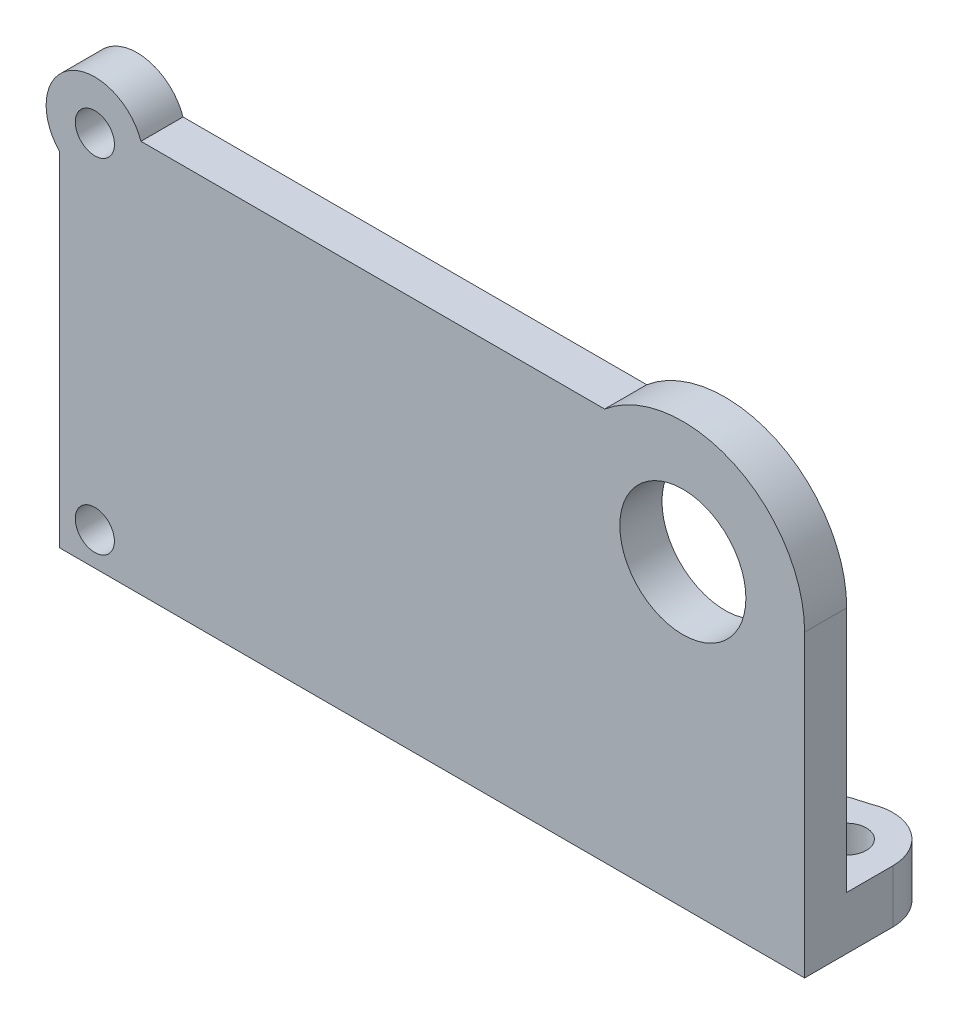
ISO-10303-21;
HEADER;
FILE_DESCRIPTION(('STEP AP214'),'2;1');
FILE_NAME('part.step','',(''),(''),'','','');
FILE_SCHEMA(('AUTOMOTIVE_DESIGN { 1 0 10303 214 1 1 1 1 }'));
ENDSEC;
DATA;
#1=APPLICATION_CONTEXT('core data for automotive mechanical design processes');
#2=APPLICATION_PROTOCOL_DEFINITION('international standard','automotive_design',2000,#1);
#3=PRODUCT_CONTEXT('',#1,'mechanical');
#4=PRODUCT('Part','Part','',(#3));
#5=PRODUCT_RELATED_PRODUCT_CATEGORY('part','',(#4));
#6=PRODUCT_DEFINITION_FORMATION('','',#4);
#7=PRODUCT_DEFINITION_CONTEXT('part definition',#1,'design');
#8=PRODUCT_DEFINITION('design','',#6,#7);
#9=PRODUCT_DEFINITION_SHAPE('','',#8);
#10=(LENGTH_UNIT() NAMED_UNIT(*) SI_UNIT(.MILLI.,.METRE.));
#11=(NAMED_UNIT(*) PLANE_ANGLE_UNIT() SI_UNIT($,.RADIAN.));
#12=(NAMED_UNIT(*) SI_UNIT($,.STERADIAN.) SOLID_ANGLE_UNIT());
#13=UNCERTAINTY_MEASURE_WITH_UNIT(LENGTH_MEASURE(1.E-05),#10,'distance_accuracy_value','');
#14=(GEOMETRIC_REPRESENTATION_CONTEXT(3) GLOBAL_UNCERTAINTY_ASSIGNED_CONTEXT((#13)) GLOBAL_UNIT_ASSIGNED_CONTEXT((#10,
#11,#12)) REPRESENTATION_CONTEXT('',''));
#15=CARTESIAN_POINT('',(0.,0.,0.));
#16=DIRECTION('',(0.,0.,1.));
#17=DIRECTION('',(1.,0.,0.));
#18=AXIS2_PLACEMENT_3D('',#15,#16,#17);
#19=CARTESIAN_POINT('',(0.,0.,0.));
#20=DIRECTION('',(0.,0.,1.));
#21=DIRECTION('',(1.,0.,0.));
#22=AXIS2_PLACEMENT_3D('',#19,#20,#21);
#23=PLANE('',#22);
#24=CARTESIAN_POINT('',(40.576,7.77,0.));
#25=DIRECTION('',(0.,0.,-1.));
#26=DIRECTION('',(-1.,0.,0.));
#27=AXIS2_PLACEMENT_3D('',#24,#25,#26);
#28=CIRCLE('',#27,4.75);
#29=CARTESIAN_POINT('',(35.826,7.77,0.));
#30=VERTEX_POINT('',#29);
#31=EDGE_CURVE('E244',#30,#30,#28,.T.);
#32=ORIENTED_EDGE('',*,*,#31,.F.);
#33=EDGE_LOOP('',(#32));
#34=FACE_BOUND('',#33,.T.);
#35=CARTESIAN_POINT('',(-3.73600000000001,13.59,0.));
#36=DIRECTION('',(0.,0.,-1.));
#37=DIRECTION('',(-1.,0.,0.));
#38=AXIS2_PLACEMENT_3D('',#35,#36,#37);
#39=CIRCLE('',#38,1.475);
#40=CARTESIAN_POINT('',(-5.21100000000001,13.59,0.));
#41=VERTEX_POINT('',#40);
#42=EDGE_CURVE('E208',#41,#41,#39,.T.);
#43=ORIENTED_EDGE('',*,*,#42,.F.);
#44=EDGE_LOOP('',(#43));
#45=FACE_BOUND('',#44,.T.);
#46=CARTESIAN_POINT('',(-3.741,-12.3,0.));
#47=DIRECTION('',(0.,0.,-1.));
#48=DIRECTION('',(-1.,0.,0.));
#49=AXIS2_PLACEMENT_3D('',#46,#47,#48);
#50=CIRCLE('',#49,1.475);
#51=CARTESIAN_POINT('',(-5.21600000000001,-12.3,0.));
#52=VERTEX_POINT('',#51);
#53=EDGE_CURVE('E168',#52,#52,#50,.T.);
#54=ORIENTED_EDGE('',*,*,#53,.F.);
#55=EDGE_LOOP('',(#54));
#56=FACE_BOUND('',#55,.T.);
#57=DIRECTION('',(1.,0.,0.));
#58=VECTOR('',#57,1.);
#59=CARTESIAN_POINT('',(0.,-10.8,0.));
#60=LINE('',#59,#58);
#61=CARTESIAN_POINT('',(35.826,-10.8,0.));
#62=VERTEX_POINT('',#61);
#63=CARTESIAN_POINT('',(49.751,-10.8,0.));
#64=VERTEX_POINT('',#63);
#65=EDGE_CURVE('E93',#62,#64,#60,.T.);
#66=ORIENTED_EDGE('',*,*,#65,.F.);
#67=DIRECTION('',(0.,-1.,0.));
#68=VECTOR('',#67,1.);
#69=CARTESIAN_POINT('',(35.826,-10.8,0.));
#70=LINE('',#69,#68);
#71=CARTESIAN_POINT('',(35.826,-14.8,0.));
#72=VERTEX_POINT('',#71);
#73=EDGE_CURVE('E97',#62,#72,#70,.T.);
#74=ORIENTED_EDGE('',*,*,#73,.T.);
#75=DIRECTION('',(-1.,0.,0.));
#76=VECTOR('',#75,1.);
#77=CARTESIAN_POINT('',(0.,-14.8,0.));
#78=LINE('',#77,#76);
#79=CARTESIAN_POINT('',(-6.416,-14.8,0.));
#80=VERTEX_POINT('',#79);
#81=EDGE_CURVE('E257',#72,#80,#78,.T.);
#82=ORIENTED_EDGE('',*,*,#81,.T.);
#83=DIRECTION('',(0.,1.,0.));
#84=VECTOR('',#83,1.);
#85=CARTESIAN_POINT('',(-6.416,0.,0.));
#86=LINE('',#85,#84);
#87=CARTESIAN_POINT('',(-6.416,11.0753976457499,0.));
#88=VERTEX_POINT('',#87);
#89=EDGE_CURVE('E211',#80,#88,#86,.T.);
#90=ORIENTED_EDGE('',*,*,#89,.T.);
#91=CARTESIAN_POINT('',(-3.73600000000001,13.59,0.));
#92=DIRECTION('',(0.,0.,-1.));
#93=DIRECTION('',(-1.,0.,0.));
#94=AXIS2_PLACEMENT_3D('',#91,#92,#93);
#95=CIRCLE('',#94,3.675);
#96=CARTESIAN_POINT('',(-0.26590994353173,14.8,0.));
#97=VERTEX_POINT('',#96);
#98=EDGE_CURVE('E197',#88,#97,#95,.T.);
#99=ORIENTED_EDGE('',*,*,#98,.T.);
#100=DIRECTION('',(1.,0.,0.));
#101=VECTOR('',#100,1.);
#102=CARTESIAN_POINT('',(0.,14.8,0.));
#103=LINE('',#102,#101);
#104=CARTESIAN_POINT('',(34.6802621326928,14.8,0.));
#105=VERTEX_POINT('',#104);
#106=EDGE_CURVE('E254',#97,#105,#103,.T.);
#107=ORIENTED_EDGE('',*,*,#106,.T.);
#108=CARTESIAN_POINT('',(40.576,7.77,0.));
#109=DIRECTION('',(0.,0.,-1.));
#110=DIRECTION('',(-1.,0.,0.));
#111=AXIS2_PLACEMENT_3D('',#108,#109,#110);
#112=CIRCLE('',#111,9.17500000000001);
#113=CARTESIAN_POINT('',(49.751,7.77,0.));
#114=VERTEX_POINT('',#113);
#115=EDGE_CURVE('E235',#105,#114,#112,.T.);
#116=ORIENTED_EDGE('',*,*,#115,.T.);
#117=DIRECTION('',(0.,-1.,0.));
#118=VECTOR('',#117,1.);
#119=CARTESIAN_POINT('',(49.751,0.,0.));
#120=LINE('',#119,#118);
#121=EDGE_CURVE('E222',#114,#64,#120,.T.);
#122=ORIENTED_EDGE('',*,*,#121,.T.);
#123=EDGE_LOOP('',(#66,#74,#82,#90,#99,#107,#116,#122));
#124=FACE_BOUND('',#123,.T.);
#125=ADVANCED_FACE('F77',(#34,#45,#56,#124),#23,.F.);
#126=CARTESIAN_POINT('',(0.,14.8,3.175));
#127=DIRECTION('',(0.,1.,0.));
#128=DIRECTION('',(0.,0.,1.));
#129=AXIS2_PLACEMENT_3D('',#126,#127,#128);
#130=PLANE('',#129);
#131=DIRECTION('',(0.,0.,-1.));
#132=VECTOR('',#131,1.);
#133=CARTESIAN_POINT('',(-0.26590994353173,14.8,13.5694696834422));
#134=LINE('',#133,#132);
#135=CARTESIAN_POINT('',(-0.26590994353173,14.8,3.175));
#136=VERTEX_POINT('',#135);
#137=EDGE_CURVE('E201',#136,#97,#134,.T.);
#138=ORIENTED_EDGE('',*,*,#137,.F.);
#139=DIRECTION('',(1.,0.,0.));
#140=VECTOR('',#139,1.);
#141=CARTESIAN_POINT('',(0.,14.8,3.175));
#142=LINE('',#141,#140);
#143=CARTESIAN_POINT('',(34.6802621326928,14.8,3.175));
#144=VERTEX_POINT('',#143);
#145=EDGE_CURVE('E253',#136,#144,#142,.T.);
#146=ORIENTED_EDGE('',*,*,#145,.T.);
#147=DIRECTION('',(0.,0.,-1.));
#148=VECTOR('',#147,1.);
#149=CARTESIAN_POINT('',(34.6802621326928,14.8,15.1599874843489));
#150=LINE('',#149,#148);
#151=EDGE_CURVE('E241',#144,#105,#150,.T.);
#152=ORIENTED_EDGE('',*,*,#151,.T.);
#153=ORIENTED_EDGE('',*,*,#106,.F.);
#154=EDGE_LOOP('',(#138,#146,#152,#153));
#155=FACE_BOUND('',#154,.T.);
#156=ADVANCED_FACE('F273',(#155),#130,.T.);
#157=CARTESIAN_POINT('',(0.,0.,3.175));
#158=DIRECTION('',(0.,0.,1.));
#159=DIRECTION('',(1.,0.,0.));
#160=AXIS2_PLACEMENT_3D('',#157,#158,#159);
#161=PLANE('',#160);
#162=CARTESIAN_POINT('',(-3.73600000000001,13.59,3.175));
#163=DIRECTION('',(0.,0.,1.));
#164=DIRECTION('',(1.,0.,0.));
#165=AXIS2_PLACEMENT_3D('',#162,#163,#164);
#166=CIRCLE('',#165,1.475);
#167=CARTESIAN_POINT('',(-2.261,13.59,3.175));
#168=VERTEX_POINT('',#167);
#169=EDGE_CURVE('E86',#168,#168,#166,.T.);
#170=ORIENTED_EDGE('',*,*,#169,.F.);
#171=EDGE_LOOP('',(#170));
#172=FACE_BOUND('',#171,.T.);
#173=CARTESIAN_POINT('',(-3.741,-12.3,3.175));
#174=DIRECTION('',(0.,0.,-1.));
#175=DIRECTION('',(-1.,0.,0.));
#176=AXIS2_PLACEMENT_3D('',#173,#174,#175);
#177=CIRCLE('',#176,1.475);
#178=CARTESIAN_POINT('',(-5.21600000000001,-12.3,3.175));
#179=VERTEX_POINT('',#178);
#180=EDGE_CURVE('E189',#179,#179,#177,.T.);
#181=ORIENTED_EDGE('',*,*,#180,.T.);
#182=EDGE_LOOP('',(#181));
#183=FACE_BOUND('',#182,.T.);
#184=ORIENTED_EDGE('',*,*,#145,.F.);
#185=CARTESIAN_POINT('',(-3.73600000000001,13.59,3.175));
#186=DIRECTION('',(0.,0.,1.));
#187=DIRECTION('',(1.,0.,0.));
#188=AXIS2_PLACEMENT_3D('',#185,#186,#187);
#189=CIRCLE('',#188,3.675);
#190=CARTESIAN_POINT('',(-6.416,11.0753976457499,3.175));
#191=VERTEX_POINT('',#190);
#192=EDGE_CURVE('E193',#191,#136,#189,.F.);
#193=ORIENTED_EDGE('',*,*,#192,.F.);
#194=DIRECTION('',(0.,-1.,0.));
#195=VECTOR('',#194,1.);
#196=CARTESIAN_POINT('',(-6.416,0.,3.175));
#197=LINE('',#196,#195);
#198=CARTESIAN_POINT('',(-6.416,-14.8,3.175));
#199=VERTEX_POINT('',#198);
#200=EDGE_CURVE('E219',#191,#199,#197,.T.);
#201=ORIENTED_EDGE('',*,*,#200,.T.);
#202=DIRECTION('',(-1.,0.,0.));
#203=VECTOR('',#202,1.);
#204=CARTESIAN_POINT('',(0.,-14.8,3.175));
#205=LINE('',#204,#203);
#206=CARTESIAN_POINT('',(49.751,-14.8,3.175));
#207=VERTEX_POINT('',#206);
#208=EDGE_CURVE('E249',#207,#199,#205,.T.);
#209=ORIENTED_EDGE('',*,*,#208,.F.);
#210=DIRECTION('',(0.,1.,0.));
#211=VECTOR('',#210,1.);
#212=CARTESIAN_POINT('',(49.751,0.,3.175));
#213=LINE('',#212,#211);
#214=CARTESIAN_POINT('',(49.751,7.77,3.175));
#215=VERTEX_POINT('',#214);
#216=EDGE_CURVE('E229',#207,#215,#213,.T.);
#217=ORIENTED_EDGE('',*,*,#216,.T.);
#218=CARTESIAN_POINT('',(40.576,7.77,3.175));
#219=DIRECTION('',(0.,0.,1.));
#220=DIRECTION('',(1.,0.,0.));
#221=AXIS2_PLACEMENT_3D('',#218,#219,#220);
#222=CIRCLE('',#221,9.17500000000001);
#223=EDGE_CURVE('E238',#144,#215,#222,.F.);
#224=ORIENTED_EDGE('',*,*,#223,.F.);
#225=EDGE_LOOP('',(#184,#193,#201,#209,#217,#224));
#226=FACE_BOUND('',#225,.T.);
#227=CARTESIAN_POINT('',(40.576,7.77,3.175));
#228=DIRECTION('',(0.,0.,1.));
#229=DIRECTION('',(1.,0.,0.));
#230=AXIS2_PLACEMENT_3D('',#227,#228,#229);
#231=CIRCLE('',#230,4.75);
#232=CARTESIAN_POINT('',(45.326,7.77,3.175));
#233=VERTEX_POINT('',#232);
#234=EDGE_CURVE('E248',#233,#233,#231,.T.);
#235=ORIENTED_EDGE('',*,*,#234,.F.);
#236=EDGE_LOOP('',(#235));
#237=FACE_BOUND('',#236,.T.);
#238=ADVANCED_FACE('F270',(#172,#183,#226,#237),#161,.T.);
#239=CARTESIAN_POINT('',(0.,-14.8,3.175));
#240=DIRECTION('',(0.,-1.,0.));
#241=DIRECTION('',(1.,0.,0.));
#242=AXIS2_PLACEMENT_3D('',#239,#240,#241);
#243=PLANE('',#242);
#244=ORIENTED_EDGE('',*,*,#81,.F.);
#245=CARTESIAN_POINT('',(48.5429519718385,-14.8,7.78987742528231));
#246=DIRECTION('',(0.,-1.,0.));
#247=DIRECTION('',(-1.,0.,0.));
#248=AXIS2_PLACEMENT_3D('',#245,#246,#247);
#249=CIRCLE('',#248,14.9131840247135);
#250=CARTESIAN_POINT('',(44.9318136631713,-14.8,-6.67949498234636));
#251=VERTEX_POINT('',#250);
#252=EDGE_CURVE('E335',#72,#251,#249,.T.);
#253=ORIENTED_EDGE('',*,*,#252,.T.);
#254=CARTESIAN_POINT('',(46.276,-14.8,-3.475));
#255=DIRECTION('',(0.,-1.,0.));
#256=DIRECTION('',(1.,0.,0.));
#257=AXIS2_PLACEMENT_3D('',#254,#255,#256);
#258=CIRCLE('',#257,3.475);
#259=CARTESIAN_POINT('',(49.751,-14.8,-3.475));
#260=VERTEX_POINT('',#259);
#261=EDGE_CURVE('E182',#251,#260,#258,.T.);
#262=ORIENTED_EDGE('',*,*,#261,.T.);
#263=DIRECTION('',(0.,0.,-1.));
#264=VECTOR('',#263,1.);
#265=CARTESIAN_POINT('',(49.751,-14.8,10.));
#266=LINE('',#265,#264);
#267=EDGE_CURVE('E166',#207,#260,#266,.T.);
#268=ORIENTED_EDGE('',*,*,#267,.F.);
#269=ORIENTED_EDGE('',*,*,#208,.T.);
#270=DIRECTION('',(0.,0.,-1.));
#271=VECTOR('',#270,1.);
#272=CARTESIAN_POINT('',(-6.416,-14.8,10.));
#273=LINE('',#272,#271);
#274=EDGE_CURVE('E215',#199,#80,#273,.T.);
#275=ORIENTED_EDGE('',*,*,#274,.T.);
#276=EDGE_LOOP('',(#244,#253,#262,#268,#269,#275));
#277=FACE_BOUND('',#276,.T.);
#278=CARTESIAN_POINT('',(46.276,-14.8,-3.475));
#279=DIRECTION('',(0.,-1.,0.));
#280=DIRECTION('',(1.,0.,0.));
#281=AXIS2_PLACEMENT_3D('',#278,#279,#280);
#282=CIRCLE('',#281,1.475);
#283=CARTESIAN_POINT('',(47.751,-14.8,-3.475));
#284=VERTEX_POINT('',#283);
#285=EDGE_CURVE('E185',#284,#284,#282,.T.);
#286=ORIENTED_EDGE('',*,*,#285,.F.);
#287=EDGE_LOOP('',(#286));
#288=FACE_BOUND('',#287,.T.);
#289=ADVANCED_FACE('F79',(#277,#288),#243,.T.);
#290=CARTESIAN_POINT('',(40.576,7.77,10.));
#291=DIRECTION('',(0.,0.,-1.));
#292=DIRECTION('',(-1.,0.,0.));
#293=AXIS2_PLACEMENT_3D('',#290,#291,#292);
#294=CYLINDRICAL_SURFACE('',#293,4.75);
#295=ORIENTED_EDGE('',*,*,#234,.T.);
#296=EDGE_LOOP('',(#295));
#297=FACE_BOUND('',#296,.T.);
#298=ORIENTED_EDGE('',*,*,#31,.T.);
#299=EDGE_LOOP('',(#298));
#300=FACE_BOUND('',#299,.T.);
#301=ADVANCED_FACE('F282',(#297,#300),#294,.F.);
#302=CARTESIAN_POINT('',(40.576,7.77,15.1599874843489));
#303=DIRECTION('',(0.,0.,-1.));
#304=DIRECTION('',(-1.,0.,0.));
#305=AXIS2_PLACEMENT_3D('',#302,#303,#304);
#306=CYLINDRICAL_SURFACE('',#305,9.17500000000001);
#307=ORIENTED_EDGE('',*,*,#151,.F.);
#308=ORIENTED_EDGE('',*,*,#223,.T.);
#309=DIRECTION('',(0.,0.,-1.));
#310=VECTOR('',#309,1.);
#311=CARTESIAN_POINT('',(49.751,7.77,10.));
#312=LINE('',#311,#310);
#313=EDGE_CURVE('E225',#215,#114,#312,.T.);
#314=ORIENTED_EDGE('',*,*,#313,.T.);
#315=ORIENTED_EDGE('',*,*,#115,.F.);
#316=EDGE_LOOP('',(#307,#308,#314,#315));
#317=FACE_BOUND('',#316,.T.);
#318=ADVANCED_FACE('F285',(#317),#306,.T.);
#319=CARTESIAN_POINT('',(49.751,0.,10.));
#320=DIRECTION('',(1.,0.,0.));
#321=DIRECTION('',(0.,0.,-1.));
#322=AXIS2_PLACEMENT_3D('',#319,#320,#321);
#323=PLANE('',#322);
#324=ORIENTED_EDGE('',*,*,#267,.T.);
#325=DIRECTION('',(0.,-1.,0.));
#326=VECTOR('',#325,1.);
#327=CARTESIAN_POINT('',(49.751,-10.8,-3.475));
#328=LINE('',#327,#326);
#329=CARTESIAN_POINT('',(49.751,-10.8,-3.475));
#330=VERTEX_POINT('',#329);
#331=EDGE_CURVE('E150',#330,#260,#328,.T.);
#332=ORIENTED_EDGE('',*,*,#331,.F.);
#333=DIRECTION('',(0.,0.,1.));
#334=VECTOR('',#333,1.);
#335=CARTESIAN_POINT('',(49.751,-10.8,0.));
#336=LINE('',#335,#334);
#337=EDGE_CURVE('E158',#330,#64,#336,.T.);
#338=ORIENTED_EDGE('',*,*,#337,.T.);
#339=ORIENTED_EDGE('',*,*,#121,.F.);
#340=ORIENTED_EDGE('',*,*,#313,.F.);
#341=ORIENTED_EDGE('',*,*,#216,.F.);
#342=EDGE_LOOP('',(#324,#332,#338,#339,#340,#341));
#343=FACE_BOUND('',#342,.T.);
#344=ADVANCED_FACE('F163',(#343),#323,.T.);
#345=CARTESIAN_POINT('',(-6.416,0.,10.));
#346=DIRECTION('',(-1.,0.,0.));
#347=DIRECTION('',(0.,0.,1.));
#348=AXIS2_PLACEMENT_3D('',#345,#346,#347);
#349=PLANE('',#348);
#350=DIRECTION('',(0.,0.,-1.));
#351=VECTOR('',#350,1.);
#352=CARTESIAN_POINT('',(-6.416,11.0753976457499,13.5694696834422));
#353=LINE('',#352,#351);
#354=EDGE_CURVE('E12',#88,#191,#353,.F.);
#355=ORIENTED_EDGE('',*,*,#354,.F.);
#356=ORIENTED_EDGE('',*,*,#89,.F.);
#357=ORIENTED_EDGE('',*,*,#274,.F.);
#358=ORIENTED_EDGE('',*,*,#200,.F.);
#359=EDGE_LOOP('',(#355,#356,#357,#358));
#360=FACE_BOUND('',#359,.T.);
#361=ADVANCED_FACE('F313',(#360),#349,.T.);
#362=CARTESIAN_POINT('',(-3.73600000000001,13.59,10.));
#363=DIRECTION('',(0.,0.,-1.));
#364=DIRECTION('',(-1.,0.,0.));
#365=AXIS2_PLACEMENT_3D('',#362,#363,#364);
#366=CYLINDRICAL_SURFACE('',#365,1.475);
#367=ORIENTED_EDGE('',*,*,#42,.T.);
#368=EDGE_LOOP('',(#367));
#369=FACE_BOUND('',#368,.T.);
#370=ORIENTED_EDGE('',*,*,#169,.T.);
#371=EDGE_LOOP('',(#370));
#372=FACE_BOUND('',#371,.T.);
#373=ADVANCED_FACE('F268',(#369,#372),#366,.F.);
#374=CARTESIAN_POINT('',(-3.73600000000001,13.59,13.5694696834422));
#375=DIRECTION('',(0.,0.,-1.));
#376=DIRECTION('',(-1.,0.,0.));
#377=AXIS2_PLACEMENT_3D('',#374,#375,#376);
#378=CYLINDRICAL_SURFACE('',#377,3.675);
#379=ORIENTED_EDGE('',*,*,#192,.T.);
#380=ORIENTED_EDGE('',*,*,#137,.T.);
#381=ORIENTED_EDGE('',*,*,#98,.F.);
#382=ORIENTED_EDGE('',*,*,#354,.T.);
#383=EDGE_LOOP('',(#379,#380,#381,#382));
#384=FACE_BOUND('',#383,.T.);
#385=ADVANCED_FACE('F298',(#384),#378,.T.);
#386=CARTESIAN_POINT('',(-3.741,-12.3,3.175));
#387=DIRECTION('',(0.,0.,-1.));
#388=DIRECTION('',(-1.,0.,0.));
#389=AXIS2_PLACEMENT_3D('',#386,#387,#388);
#390=CYLINDRICAL_SURFACE('',#389,1.475);
#391=ORIENTED_EDGE('',*,*,#180,.F.);
#392=EDGE_LOOP('',(#391));
#393=FACE_BOUND('',#392,.T.);
#394=ORIENTED_EDGE('',*,*,#53,.T.);
#395=EDGE_LOOP('',(#394));
#396=FACE_BOUND('',#395,.T.);
#397=ADVANCED_FACE('F296',(#393,#396),#390,.F.);
#398=CARTESIAN_POINT('',(46.276,-10.8,-3.475));
#399=DIRECTION('',(0.,-1.,0.));
#400=DIRECTION('',(1.,0.,0.));
#401=AXIS2_PLACEMENT_3D('',#398,#399,#400);
#402=CYLINDRICAL_SURFACE('',#401,3.475);
#403=ORIENTED_EDGE('',*,*,#331,.T.);
#404=ORIENTED_EDGE('',*,*,#261,.F.);
#405=DIRECTION('',(0.,-1.,0.));
#406=VECTOR('',#405,1.);
#407=CARTESIAN_POINT('',(44.9318136631713,-12.8,-6.67949498234634));
#408=LINE('',#407,#406);
#409=CARTESIAN_POINT('',(44.9318136631713,-10.8,-6.67949498234635));
#410=VERTEX_POINT('',#409);
#411=EDGE_CURVE('E152',#410,#251,#408,.T.);
#412=ORIENTED_EDGE('',*,*,#411,.F.);
#413=CARTESIAN_POINT('',(46.276,-10.8,-3.475));
#414=DIRECTION('',(0.,-1.,0.));
#415=DIRECTION('',(1.,0.,0.));
#416=AXIS2_PLACEMENT_3D('',#413,#414,#415);
#417=CIRCLE('',#416,3.475);
#418=EDGE_CURVE('E147',#410,#330,#417,.T.);
#419=ORIENTED_EDGE('',*,*,#418,.T.);
#420=EDGE_LOOP('',(#403,#404,#412,#419));
#421=FACE_BOUND('',#420,.T.);
#422=ADVANCED_FACE('F149',(#421),#402,.T.);
#423=CARTESIAN_POINT('',(46.276,-10.8,-3.475));
#424=DIRECTION('',(0.,-1.,0.));
#425=DIRECTION('',(1.,0.,0.));
#426=AXIS2_PLACEMENT_3D('',#423,#424,#425);
#427=CYLINDRICAL_SURFACE('',#426,1.475);
#428=CARTESIAN_POINT('',(46.276,-10.8,-3.475));
#429=DIRECTION('',(0.,-1.,0.));
#430=DIRECTION('',(1.,0.,0.));
#431=AXIS2_PLACEMENT_3D('',#428,#429,#430);
#432=CIRCLE('',#431,1.475);
#433=CARTESIAN_POINT('',(47.751,-10.8,-3.475));
#434=VERTEX_POINT('',#433);
#435=EDGE_CURVE('E169',#434,#434,#432,.T.);
#436=ORIENTED_EDGE('',*,*,#435,.F.);
#437=EDGE_LOOP('',(#436));
#438=FACE_BOUND('',#437,.T.);
#439=ORIENTED_EDGE('',*,*,#285,.T.);
#440=EDGE_LOOP('',(#439));
#441=FACE_BOUND('',#440,.T.);
#442=ADVANCED_FACE('F305',(#438,#441),#427,.F.);
#443=CARTESIAN_POINT('',(0.,-10.8,0.));
#444=DIRECTION('',(0.,-1.,0.));
#445=DIRECTION('',(1.,0.,0.));
#446=AXIS2_PLACEMENT_3D('',#443,#444,#445);
#447=PLANE('',#446);
#448=ORIENTED_EDGE('',*,*,#418,.F.);
#449=CARTESIAN_POINT('',(48.5429519718385,-10.8,7.78987742528231));
#450=DIRECTION('',(0.,-1.,0.));
#451=DIRECTION('',(-1.,0.,0.));
#452=AXIS2_PLACEMENT_3D('',#449,#450,#451);
#453=CIRCLE('',#452,14.9131840247135);
#454=EDGE_CURVE('E338',#62,#410,#453,.T.);
#455=ORIENTED_EDGE('',*,*,#454,.F.);
#456=ORIENTED_EDGE('',*,*,#65,.T.);
#457=ORIENTED_EDGE('',*,*,#337,.F.);
#458=EDGE_LOOP('',(#448,#455,#456,#457));
#459=FACE_BOUND('',#458,.T.);
#460=ORIENTED_EDGE('',*,*,#435,.T.);
#461=EDGE_LOOP('',(#460));
#462=FACE_BOUND('',#461,.T.);
#463=ADVANCED_FACE('F171',(#459,#462),#447,.F.);
#464=CARTESIAN_POINT('',(48.5429519718385,-10.8,7.78987742528231));
#465=DIRECTION('',(0.,-1.,0.));
#466=DIRECTION('',(1.,0.,0.));
#467=AXIS2_PLACEMENT_3D('',#464,#465,#466);
#468=CYLINDRICAL_SURFACE('',#467,14.9131840247135);
#469=ORIENTED_EDGE('',*,*,#454,.T.);
#470=ORIENTED_EDGE('',*,*,#411,.T.);
#471=ORIENTED_EDGE('',*,*,#252,.F.);
#472=ORIENTED_EDGE('',*,*,#73,.F.);
#473=EDGE_LOOP('',(#469,#470,#471,#472));
#474=FACE_BOUND('',#473,.T.);
#475=ADVANCED_FACE('F337',(#474),#468,.T.);
#476=CLOSED_SHELL('',(#125,#156,#238,#289,#301,#318,#344,#361,#373,#385,#397,#422,#442,#463,#475));
#477=MANIFOLD_SOLID_BREP('B2',#476);
#478=ADVANCED_BREP_SHAPE_REPRESENTATION('',(#18,#477),#14);
#479=SHAPE_DEFINITION_REPRESENTATION(#9,#478);
ENDSEC;
END-ISO-10303-21;
